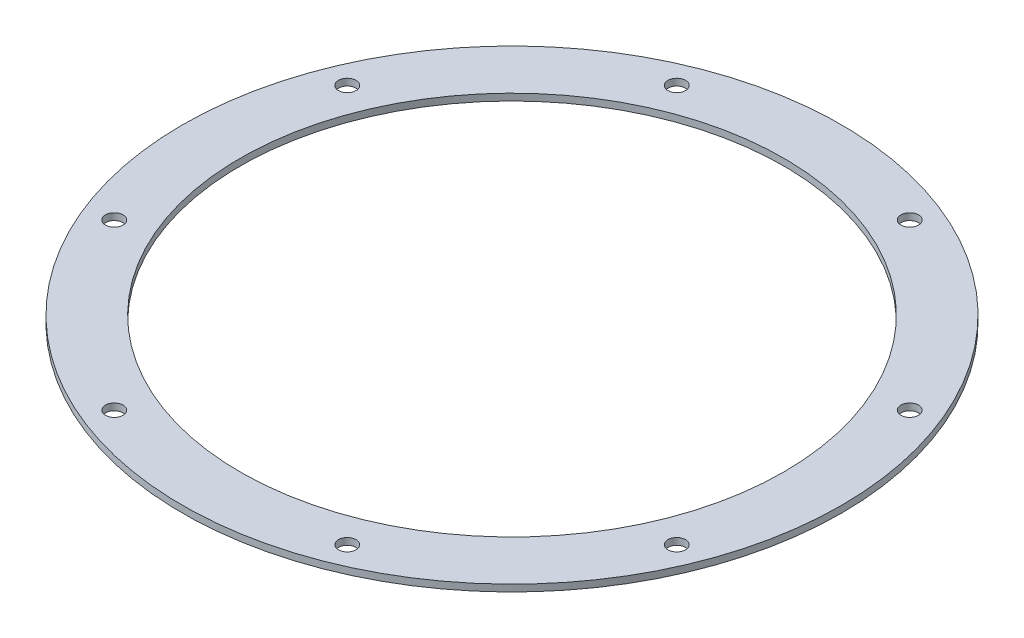
ISO-10303-21;
HEADER;
FILE_DESCRIPTION(('STEP AP214'),'2;1');
FILE_NAME('part.step','',(''),(''),'','','');
FILE_SCHEMA(('AUTOMOTIVE_DESIGN { 1 0 10303 214 1 1 1 1 }'));
ENDSEC;
DATA;
#1=APPLICATION_CONTEXT('core data for automotive mechanical design processes');
#2=APPLICATION_PROTOCOL_DEFINITION('international standard','automotive_design',2000,#1);
#3=PRODUCT_CONTEXT('',#1,'mechanical');
#4=PRODUCT('Part','Part','',(#3));
#5=PRODUCT_RELATED_PRODUCT_CATEGORY('part','',(#4));
#6=PRODUCT_DEFINITION_FORMATION('','',#4);
#7=PRODUCT_DEFINITION_CONTEXT('part definition',#1,'design');
#8=PRODUCT_DEFINITION('design','',#6,#7);
#9=PRODUCT_DEFINITION_SHAPE('','',#8);
#10=(LENGTH_UNIT() NAMED_UNIT(*) SI_UNIT(.MILLI.,.METRE.));
#11=(NAMED_UNIT(*) PLANE_ANGLE_UNIT() SI_UNIT($,.RADIAN.));
#12=(NAMED_UNIT(*) SI_UNIT($,.STERADIAN.) SOLID_ANGLE_UNIT());
#13=UNCERTAINTY_MEASURE_WITH_UNIT(LENGTH_MEASURE(1.E-05),#10,'distance_accuracy_value','');
#14=(GEOMETRIC_REPRESENTATION_CONTEXT(3) GLOBAL_UNCERTAINTY_ASSIGNED_CONTEXT((#13)) GLOBAL_UNIT_ASSIGNED_CONTEXT((#10,
#11,#12)) REPRESENTATION_CONTEXT('',''));
#15=CARTESIAN_POINT('',(0.,0.,0.));
#16=DIRECTION('',(0.,0.,1.));
#17=DIRECTION('',(1.,0.,0.));
#18=AXIS2_PLACEMENT_3D('',#15,#16,#17);
#19=CARTESIAN_POINT('',(-250.001181375407,-146.99696890097,0.00373171541061344));
#20=DIRECTION('',(0.,-1.,0.));
#21=DIRECTION('',(1.,0.,0.));
#22=AXIS2_PLACEMENT_3D('',#19,#20,#21);
#23=CYLINDRICAL_SURFACE('',#22,242.5);
#24=CARTESIAN_POINT('',(-250.001181375407,-146.99696890097,0.00373171541061344));
#25=DIRECTION('',(0.,-1.,0.));
#26=DIRECTION('',(1.,0.,0.));
#27=AXIS2_PLACEMENT_3D('',#24,#25,#26);
#28=CIRCLE('',#27,242.5);
#29=CARTESIAN_POINT('',(-7.50118137540701,-146.996968900971,0.00373171541061344));
#30=VERTEX_POINT('',#29);
#31=EDGE_CURVE('E90',#30,#30,#28,.T.);
#32=ORIENTED_EDGE('',*,*,#31,.F.);
#33=EDGE_LOOP('',(#32));
#34=FACE_BOUND('',#33,.T.);
#35=CARTESIAN_POINT('',(-250.001181375407,-141.99696890097,0.00373171541061344));
#36=DIRECTION('',(0.,-1.,0.));
#37=DIRECTION('',(1.,0.,0.));
#38=AXIS2_PLACEMENT_3D('',#35,#36,#37);
#39=CIRCLE('',#38,242.5);
#40=CARTESIAN_POINT('',(-7.50118137540695,-141.996968900971,0.00373171541061344));
#41=VERTEX_POINT('',#40);
#42=EDGE_CURVE('E62',#41,#41,#39,.T.);
#43=ORIENTED_EDGE('',*,*,#42,.T.);
#44=EDGE_LOOP('',(#43));
#45=FACE_BOUND('',#44,.T.);
#46=ADVANCED_FACE('F45',(#34,#45),#23,.T.);
#47=CARTESIAN_POINT('',(-250.001181375407,-146.996968900969,0.00373171541061344));
#48=DIRECTION('',(0.,-1.,0.));
#49=DIRECTION('',(1.,0.,0.));
#50=AXIS2_PLACEMENT_3D('',#47,#48,#49);
#51=CYLINDRICAL_SURFACE('',#50,200.);
#52=CARTESIAN_POINT('',(-250.001181375407,-146.996968900969,0.00373171541061344));
#53=DIRECTION('',(0.,-1.,0.));
#54=DIRECTION('',(1.,0.,0.));
#55=AXIS2_PLACEMENT_3D('',#52,#53,#54);
#56=CIRCLE('',#55,200.);
#57=CARTESIAN_POINT('',(-50.001181375407,-146.996968900971,0.00373171541061344));
#58=VERTEX_POINT('',#57);
#59=EDGE_CURVE('E94',#58,#58,#56,.F.);
#60=ORIENTED_EDGE('',*,*,#59,.F.);
#61=EDGE_LOOP('',(#60));
#62=FACE_BOUND('',#61,.T.);
#63=CARTESIAN_POINT('',(-250.001181375407,-141.996968900969,0.00373171541061344));
#64=DIRECTION('',(0.,-1.,0.));
#65=DIRECTION('',(1.,0.,0.));
#66=AXIS2_PLACEMENT_3D('',#63,#64,#65);
#67=CIRCLE('',#66,200.);
#68=CARTESIAN_POINT('',(-50.0011813754069,-141.996968900971,0.00373171541061344));
#69=VERTEX_POINT('',#68);
#70=EDGE_CURVE('E65',#69,#69,#67,.F.);
#71=ORIENTED_EDGE('',*,*,#70,.T.);
#72=EDGE_LOOP('',(#71));
#73=FACE_BOUND('',#72,.T.);
#74=ADVANCED_FACE('F143',(#62,#73),#51,.F.);
#75=CARTESIAN_POINT('',(-335.722270225186,-146.996968900969,206.95274699794));
#76=DIRECTION('',(0.,-1.,0.));
#77=DIRECTION('',(1.,0.,0.));
#78=AXIS2_PLACEMENT_3D('',#75,#76,#77);
#79=CYLINDRICAL_SURFACE('',#78,6.5);
#80=CARTESIAN_POINT('',(-335.722270225186,-146.996968900969,206.95274699794));
#81=DIRECTION('',(0.,-1.,0.));
#82=DIRECTION('',(1.,0.,0.));
#83=AXIS2_PLACEMENT_3D('',#80,#81,#82);
#84=CIRCLE('',#83,6.5);
#85=CARTESIAN_POINT('',(-329.222270225186,-146.996968900969,206.95274699794));
#86=VERTEX_POINT('',#85);
#87=EDGE_CURVE('E99',#86,#86,#84,.F.);
#88=ORIENTED_EDGE('',*,*,#87,.F.);
#89=EDGE_LOOP('',(#88));
#90=FACE_BOUND('',#89,.T.);
#91=CARTESIAN_POINT('',(-335.722270225186,-141.996968900969,206.95274699794));
#92=DIRECTION('',(0.,-1.,0.));
#93=DIRECTION('',(1.,0.,0.));
#94=AXIS2_PLACEMENT_3D('',#91,#92,#93);
#95=CIRCLE('',#94,6.5);
#96=CARTESIAN_POINT('',(-329.222270225186,-141.996968900969,206.95274699794));
#97=VERTEX_POINT('',#96);
#98=EDGE_CURVE('E68',#97,#97,#95,.F.);
#99=ORIENTED_EDGE('',*,*,#98,.T.);
#100=EDGE_LOOP('',(#99));
#101=FACE_BOUND('',#100,.T.);
#102=ADVANCED_FACE('F148',(#90,#101),#79,.F.);
#103=CARTESIAN_POINT('',(-456.950196657935,-146.996968900968,85.7248205651923));
#104=DIRECTION('',(0.,-1.,0.));
#105=DIRECTION('',(1.,0.,0.));
#106=AXIS2_PLACEMENT_3D('',#103,#104,#105);
#107=CYLINDRICAL_SURFACE('',#106,6.5);
#108=CARTESIAN_POINT('',(-456.950196657935,-146.996968900968,85.7248205651923));
#109=DIRECTION('',(0.,-1.,0.));
#110=DIRECTION('',(1.,0.,0.));
#111=AXIS2_PLACEMENT_3D('',#108,#109,#110);
#112=CIRCLE('',#111,6.5);
#113=CARTESIAN_POINT('',(-450.450196657935,-146.996968900968,85.7248205651923));
#114=VERTEX_POINT('',#113);
#115=EDGE_CURVE('E104',#114,#114,#112,.F.);
#116=ORIENTED_EDGE('',*,*,#115,.F.);
#117=EDGE_LOOP('',(#116));
#118=FACE_BOUND('',#117,.T.);
#119=CARTESIAN_POINT('',(-456.950196657935,-141.996968900968,85.7248205651923));
#120=DIRECTION('',(0.,-1.,0.));
#121=DIRECTION('',(1.,0.,0.));
#122=AXIS2_PLACEMENT_3D('',#119,#120,#121);
#123=CIRCLE('',#122,6.5);
#124=CARTESIAN_POINT('',(-450.450196657935,-141.996968900968,85.7248205651923));
#125=VERTEX_POINT('',#124);
#126=EDGE_CURVE('E71',#125,#125,#123,.F.);
#127=ORIENTED_EDGE('',*,*,#126,.T.);
#128=EDGE_LOOP('',(#127));
#129=FACE_BOUND('',#128,.T.);
#130=ADVANCED_FACE('F155',(#118,#129),#107,.F.);
#131=CARTESIAN_POINT('',(-456.950196657936,-146.996968900968,-85.717357134368));
#132=DIRECTION('',(0.,-1.,0.));
#133=DIRECTION('',(1.,0.,0.));
#134=AXIS2_PLACEMENT_3D('',#131,#132,#133);
#135=CYLINDRICAL_SURFACE('',#134,6.5);
#136=CARTESIAN_POINT('',(-456.950196657936,-146.996968900968,-85.717357134368));
#137=DIRECTION('',(0.,-1.,0.));
#138=DIRECTION('',(1.,0.,0.));
#139=AXIS2_PLACEMENT_3D('',#136,#137,#138);
#140=CIRCLE('',#139,6.5);
#141=CARTESIAN_POINT('',(-450.450196657936,-146.996968900968,-85.717357134368));
#142=VERTEX_POINT('',#141);
#143=EDGE_CURVE('E107',#142,#142,#140,.F.);
#144=ORIENTED_EDGE('',*,*,#143,.F.);
#145=EDGE_LOOP('',(#144));
#146=FACE_BOUND('',#145,.T.);
#147=CARTESIAN_POINT('',(-456.950196657936,-141.996968900968,-85.717357134368));
#148=DIRECTION('',(0.,-1.,0.));
#149=DIRECTION('',(1.,0.,0.));
#150=AXIS2_PLACEMENT_3D('',#147,#148,#149);
#151=CIRCLE('',#150,6.5);
#152=CARTESIAN_POINT('',(-450.450196657936,-141.996968900968,-85.717357134368));
#153=VERTEX_POINT('',#152);
#154=EDGE_CURVE('E74',#153,#153,#151,.F.);
#155=ORIENTED_EDGE('',*,*,#154,.T.);
#156=EDGE_LOOP('',(#155));
#157=FACE_BOUND('',#156,.T.);
#158=ADVANCED_FACE('F159',(#146,#157),#135,.F.);
#159=CARTESIAN_POINT('',(-335.722270225189,-146.996968900969,-206.945283567117));
#160=DIRECTION('',(0.,-1.,0.));
#161=DIRECTION('',(1.,0.,0.));
#162=AXIS2_PLACEMENT_3D('',#159,#160,#161);
#163=CYLINDRICAL_SURFACE('',#162,6.5);
#164=CARTESIAN_POINT('',(-335.722270225189,-146.996968900969,-206.945283567117));
#165=DIRECTION('',(0.,-1.,0.));
#166=DIRECTION('',(1.,0.,0.));
#167=AXIS2_PLACEMENT_3D('',#164,#165,#166);
#168=CIRCLE('',#167,6.5);
#169=CARTESIAN_POINT('',(-329.222270225189,-146.996968900969,-206.945283567117));
#170=VERTEX_POINT('',#169);
#171=EDGE_CURVE('E110',#170,#170,#168,.F.);
#172=ORIENTED_EDGE('',*,*,#171,.F.);
#173=EDGE_LOOP('',(#172));
#174=FACE_BOUND('',#173,.T.);
#175=CARTESIAN_POINT('',(-335.722270225189,-141.996968900969,-206.945283567117));
#176=DIRECTION('',(0.,-1.,0.));
#177=DIRECTION('',(1.,0.,0.));
#178=AXIS2_PLACEMENT_3D('',#175,#176,#177);
#179=CIRCLE('',#178,6.5);
#180=CARTESIAN_POINT('',(-329.222270225189,-141.996968900969,-206.945283567117));
#181=VERTEX_POINT('',#180);
#182=EDGE_CURVE('E77',#181,#181,#179,.F.);
#183=ORIENTED_EDGE('',*,*,#182,.T.);
#184=EDGE_LOOP('',(#183));
#185=FACE_BOUND('',#184,.T.);
#186=ADVANCED_FACE('F163',(#174,#185),#163,.F.);
#187=CARTESIAN_POINT('',(-164.280092525629,-146.99696890097,-206.945283567118));
#188=DIRECTION('',(0.,-1.,0.));
#189=DIRECTION('',(1.,0.,0.));
#190=AXIS2_PLACEMENT_3D('',#187,#188,#189);
#191=CYLINDRICAL_SURFACE('',#190,6.5);
#192=CARTESIAN_POINT('',(-164.280092525629,-146.99696890097,-206.945283567118));
#193=DIRECTION('',(0.,-1.,0.));
#194=DIRECTION('',(1.,0.,0.));
#195=AXIS2_PLACEMENT_3D('',#192,#193,#194);
#196=CIRCLE('',#195,6.5);
#197=CARTESIAN_POINT('',(-157.780092525629,-146.99696890097,-206.945283567118));
#198=VERTEX_POINT('',#197);
#199=EDGE_CURVE('E113',#198,#198,#196,.F.);
#200=ORIENTED_EDGE('',*,*,#199,.F.);
#201=EDGE_LOOP('',(#200));
#202=FACE_BOUND('',#201,.T.);
#203=CARTESIAN_POINT('',(-164.280092525629,-141.99696890097,-206.945283567118));
#204=DIRECTION('',(0.,-1.,0.));
#205=DIRECTION('',(1.,0.,0.));
#206=AXIS2_PLACEMENT_3D('',#203,#204,#205);
#207=CIRCLE('',#206,6.5);
#208=CARTESIAN_POINT('',(-157.780092525629,-141.99696890097,-206.945283567118));
#209=VERTEX_POINT('',#208);
#210=EDGE_CURVE('E80',#209,#209,#207,.F.);
#211=ORIENTED_EDGE('',*,*,#210,.T.);
#212=EDGE_LOOP('',(#211));
#213=FACE_BOUND('',#212,.T.);
#214=ADVANCED_FACE('F125',(#202,#213),#191,.F.);
#215=CARTESIAN_POINT('',(-43.0521660928798,-146.996968900971,-85.7173571343711));
#216=DIRECTION('',(0.,-1.,0.));
#217=DIRECTION('',(1.,0.,0.));
#218=AXIS2_PLACEMENT_3D('',#215,#216,#217);
#219=CYLINDRICAL_SURFACE('',#218,6.5);
#220=CARTESIAN_POINT('',(-43.0521660928798,-146.996968900971,-85.7173571343711));
#221=DIRECTION('',(0.,-1.,0.));
#222=DIRECTION('',(1.,0.,0.));
#223=AXIS2_PLACEMENT_3D('',#220,#221,#222);
#224=CIRCLE('',#223,6.5);
#225=CARTESIAN_POINT('',(-36.5521660928798,-146.996968900971,-85.7173571343711));
#226=VERTEX_POINT('',#225);
#227=EDGE_CURVE('E58',#226,#226,#224,.F.);
#228=ORIENTED_EDGE('',*,*,#227,.F.);
#229=EDGE_LOOP('',(#228));
#230=FACE_BOUND('',#229,.T.);
#231=CARTESIAN_POINT('',(-43.0521660928798,-141.996968900971,-85.7173571343711));
#232=DIRECTION('',(0.,-1.,0.));
#233=DIRECTION('',(1.,0.,0.));
#234=AXIS2_PLACEMENT_3D('',#231,#232,#233);
#235=CIRCLE('',#234,6.5);
#236=CARTESIAN_POINT('',(-36.5521660928798,-141.996968900971,-85.7173571343711));
#237=VERTEX_POINT('',#236);
#238=EDGE_CURVE('E83',#237,#237,#235,.F.);
#239=ORIENTED_EDGE('',*,*,#238,.T.);
#240=EDGE_LOOP('',(#239));
#241=FACE_BOUND('',#240,.T.);
#242=ADVANCED_FACE('F121',(#230,#241),#219,.F.);
#243=CARTESIAN_POINT('',(-43.0521660928785,-146.996968900971,85.7248205651892));
#244=DIRECTION('',(0.,-1.,0.));
#245=DIRECTION('',(1.,0.,0.));
#246=AXIS2_PLACEMENT_3D('',#243,#244,#245);
#247=CYLINDRICAL_SURFACE('',#246,6.5);
#248=CARTESIAN_POINT('',(-43.0521660928785,-146.996968900971,85.7248205651892));
#249=DIRECTION('',(0.,-1.,0.));
#250=DIRECTION('',(1.,0.,0.));
#251=AXIS2_PLACEMENT_3D('',#248,#249,#250);
#252=CIRCLE('',#251,6.5);
#253=CARTESIAN_POINT('',(-36.5521660928785,-146.996968900971,85.7248205651892));
#254=VERTEX_POINT('',#253);
#255=EDGE_CURVE('E53',#254,#254,#252,.F.);
#256=ORIENTED_EDGE('',*,*,#255,.F.);
#257=EDGE_LOOP('',(#256));
#258=FACE_BOUND('',#257,.T.);
#259=CARTESIAN_POINT('',(-43.0521660928785,-141.996968900971,85.7248205651892));
#260=DIRECTION('',(0.,-1.,0.));
#261=DIRECTION('',(1.,0.,0.));
#262=AXIS2_PLACEMENT_3D('',#259,#260,#261);
#263=CIRCLE('',#262,6.5);
#264=CARTESIAN_POINT('',(-36.5521660928785,-141.996968900971,85.7248205651892));
#265=VERTEX_POINT('',#264);
#266=EDGE_CURVE('E85',#265,#265,#263,.F.);
#267=ORIENTED_EDGE('',*,*,#266,.T.);
#268=EDGE_LOOP('',(#267));
#269=FACE_BOUND('',#268,.T.);
#270=ADVANCED_FACE('F124',(#258,#269),#247,.F.);
#271=CARTESIAN_POINT('',(-164.280092525626,-146.99696890097,206.952746997938));
#272=DIRECTION('',(0.,-1.,0.));
#273=DIRECTION('',(1.,0.,0.));
#274=AXIS2_PLACEMENT_3D('',#271,#272,#273);
#275=CYLINDRICAL_SURFACE('',#274,6.5);
#276=CARTESIAN_POINT('',(-164.280092525626,-146.99696890097,206.952746997938));
#277=DIRECTION('',(0.,-1.,0.));
#278=DIRECTION('',(1.,0.,0.));
#279=AXIS2_PLACEMENT_3D('',#276,#277,#278);
#280=CIRCLE('',#279,6.5);
#281=CARTESIAN_POINT('',(-157.780092525626,-146.99696890097,206.952746997938));
#282=VERTEX_POINT('',#281);
#283=EDGE_CURVE('E12',#282,#282,#280,.F.);
#284=ORIENTED_EDGE('',*,*,#283,.F.);
#285=EDGE_LOOP('',(#284));
#286=FACE_BOUND('',#285,.T.);
#287=CARTESIAN_POINT('',(-164.280092525626,-141.99696890097,206.952746997938));
#288=DIRECTION('',(0.,-1.,0.));
#289=DIRECTION('',(1.,0.,0.));
#290=AXIS2_PLACEMENT_3D('',#287,#288,#289);
#291=CIRCLE('',#290,6.5);
#292=CARTESIAN_POINT('',(-157.780092525626,-141.99696890097,206.952746997938));
#293=VERTEX_POINT('',#292);
#294=EDGE_CURVE('E49',#293,#293,#291,.F.);
#295=ORIENTED_EDGE('',*,*,#294,.T.);
#296=EDGE_LOOP('',(#295));
#297=FACE_BOUND('',#296,.T.);
#298=ADVANCED_FACE('F47',(#286,#297),#275,.F.);
#299=CARTESIAN_POINT('',(-250.001181375407,-146.996968900969,0.00373171541061344));
#300=DIRECTION('',(0.,-1.,0.));
#301=DIRECTION('',(1.,0.,0.));
#302=AXIS2_PLACEMENT_3D('',#299,#300,#301);
#303=PLANE('',#302);
#304=ORIENTED_EDGE('',*,*,#31,.T.);
#305=EDGE_LOOP('',(#304));
#306=FACE_BOUND('',#305,.T.);
#307=ORIENTED_EDGE('',*,*,#59,.T.);
#308=EDGE_LOOP('',(#307));
#309=FACE_BOUND('',#308,.T.);
#310=ORIENTED_EDGE('',*,*,#87,.T.);
#311=EDGE_LOOP('',(#310));
#312=FACE_BOUND('',#311,.T.);
#313=ORIENTED_EDGE('',*,*,#115,.T.);
#314=EDGE_LOOP('',(#313));
#315=FACE_BOUND('',#314,.T.);
#316=ORIENTED_EDGE('',*,*,#143,.T.);
#317=EDGE_LOOP('',(#316));
#318=FACE_BOUND('',#317,.T.);
#319=ORIENTED_EDGE('',*,*,#171,.T.);
#320=EDGE_LOOP('',(#319));
#321=FACE_BOUND('',#320,.T.);
#322=ORIENTED_EDGE('',*,*,#199,.T.);
#323=EDGE_LOOP('',(#322));
#324=FACE_BOUND('',#323,.T.);
#325=ORIENTED_EDGE('',*,*,#227,.T.);
#326=EDGE_LOOP('',(#325));
#327=FACE_BOUND('',#326,.T.);
#328=ORIENTED_EDGE('',*,*,#255,.T.);
#329=EDGE_LOOP('',(#328));
#330=FACE_BOUND('',#329,.T.);
#331=ORIENTED_EDGE('',*,*,#283,.T.);
#332=EDGE_LOOP('',(#331));
#333=FACE_BOUND('',#332,.T.);
#334=ADVANCED_FACE('F118',(#306,#309,#312,#315,#318,#321,#324,#327,#330,#333),#303,.T.);
#335=CARTESIAN_POINT('',(-250.001181375407,-141.996968900969,0.00373171541061344));
#336=DIRECTION('',(0.,-1.,0.));
#337=DIRECTION('',(1.,0.,0.));
#338=AXIS2_PLACEMENT_3D('',#335,#336,#337);
#339=PLANE('',#338);
#340=ORIENTED_EDGE('',*,*,#42,.F.);
#341=EDGE_LOOP('',(#340));
#342=FACE_BOUND('',#341,.T.);
#343=ORIENTED_EDGE('',*,*,#70,.F.);
#344=EDGE_LOOP('',(#343));
#345=FACE_BOUND('',#344,.T.);
#346=ORIENTED_EDGE('',*,*,#98,.F.);
#347=EDGE_LOOP('',(#346));
#348=FACE_BOUND('',#347,.T.);
#349=ORIENTED_EDGE('',*,*,#126,.F.);
#350=EDGE_LOOP('',(#349));
#351=FACE_BOUND('',#350,.T.);
#352=ORIENTED_EDGE('',*,*,#154,.F.);
#353=EDGE_LOOP('',(#352));
#354=FACE_BOUND('',#353,.T.);
#355=ORIENTED_EDGE('',*,*,#182,.F.);
#356=EDGE_LOOP('',(#355));
#357=FACE_BOUND('',#356,.T.);
#358=ORIENTED_EDGE('',*,*,#210,.F.);
#359=EDGE_LOOP('',(#358));
#360=FACE_BOUND('',#359,.T.);
#361=ORIENTED_EDGE('',*,*,#238,.F.);
#362=EDGE_LOOP('',(#361));
#363=FACE_BOUND('',#362,.T.);
#364=ORIENTED_EDGE('',*,*,#266,.F.);
#365=EDGE_LOOP('',(#364));
#366=FACE_BOUND('',#365,.T.);
#367=ORIENTED_EDGE('',*,*,#294,.F.);
#368=EDGE_LOOP('',(#367));
#369=FACE_BOUND('',#368,.T.);
#370=ADVANCED_FACE('F129',(#342,#345,#348,#351,#354,#357,#360,#363,#366,#369),#339,.F.);
#371=CLOSED_SHELL('',(#46,#74,#102,#130,#158,#186,#214,#242,#270,#298,#334,#370));
#372=MANIFOLD_SOLID_BREP('B2',#371);
#373=ADVANCED_BREP_SHAPE_REPRESENTATION('',(#18,#372),#14);
#374=SHAPE_DEFINITION_REPRESENTATION(#9,#373);
ENDSEC;
END-ISO-10303-21;
